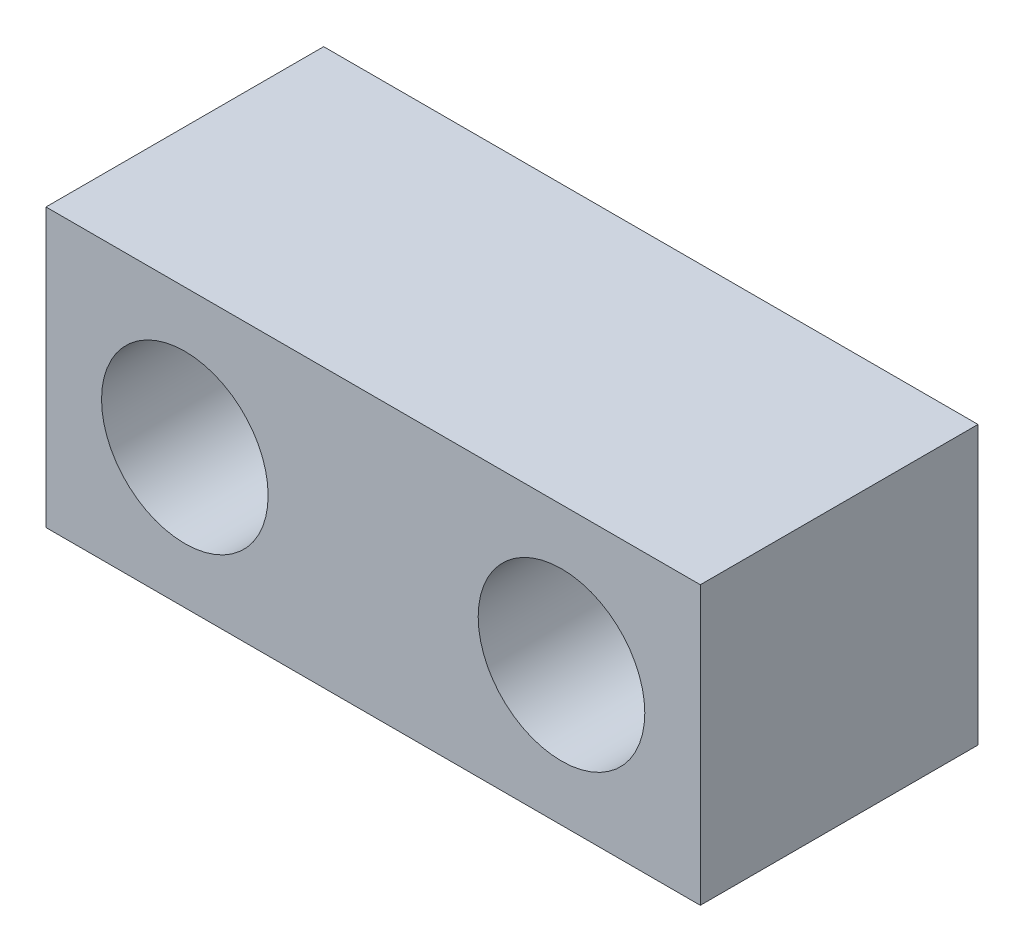
ISO-10303-21;
HEADER;
FILE_DESCRIPTION(('STEP AP214'),'2;1');
FILE_NAME('part.step','',(''),(''),'','','');
FILE_SCHEMA(('AUTOMOTIVE_DESIGN { 1 0 10303 214 1 1 1 1 }'));
ENDSEC;
DATA;
#1=APPLICATION_CONTEXT('core data for automotive mechanical design processes');
#2=APPLICATION_PROTOCOL_DEFINITION('international standard','automotive_design',2000,#1);
#3=PRODUCT_CONTEXT('',#1,'mechanical');
#4=PRODUCT('Part','Part','',(#3));
#5=PRODUCT_RELATED_PRODUCT_CATEGORY('part','',(#4));
#6=PRODUCT_DEFINITION_FORMATION('','',#4);
#7=PRODUCT_DEFINITION_CONTEXT('part definition',#1,'design');
#8=PRODUCT_DEFINITION('design','',#6,#7);
#9=PRODUCT_DEFINITION_SHAPE('','',#8);
#10=(LENGTH_UNIT() NAMED_UNIT(*) SI_UNIT(.MILLI.,.METRE.));
#11=(NAMED_UNIT(*) PLANE_ANGLE_UNIT() SI_UNIT($,.RADIAN.));
#12=(NAMED_UNIT(*) SI_UNIT($,.STERADIAN.) SOLID_ANGLE_UNIT());
#13=UNCERTAINTY_MEASURE_WITH_UNIT(LENGTH_MEASURE(1.E-05),#10,'distance_accuracy_value','');
#14=(GEOMETRIC_REPRESENTATION_CONTEXT(3) GLOBAL_UNCERTAINTY_ASSIGNED_CONTEXT((#13)) GLOBAL_UNIT_ASSIGNED_CONTEXT((#10,
#11,#12)) REPRESENTATION_CONTEXT('',''));
#15=CARTESIAN_POINT('',(0.,0.,0.));
#16=DIRECTION('',(0.,0.,1.));
#17=DIRECTION('',(1.,0.,0.));
#18=AXIS2_PLACEMENT_3D('',#15,#16,#17);
#19=CARTESIAN_POINT('',(0.,0.,20.));
#20=DIRECTION('',(1.,0.,0.));
#21=DIRECTION('',(0.,0.,-1.));
#22=AXIS2_PLACEMENT_3D('',#19,#20,#21);
#23=PLANE('',#22);
#24=DIRECTION('',(0.,-1.,0.));
#25=VECTOR('',#24,1.);
#26=CARTESIAN_POINT('',(0.,0.,0.));
#27=LINE('',#26,#25);
#28=CARTESIAN_POINT('',(0.,20.,0.));
#29=VERTEX_POINT('',#28);
#30=CARTESIAN_POINT('',(0.,0.,0.));
#31=VERTEX_POINT('',#30);
#32=EDGE_CURVE('E94',#29,#31,#27,.T.);
#33=ORIENTED_EDGE('',*,*,#32,.T.);
#34=DIRECTION('',(0.,0.,-1.));
#35=VECTOR('',#34,1.);
#36=CARTESIAN_POINT('',(0.,0.,20.));
#37=LINE('',#36,#35);
#38=CARTESIAN_POINT('',(0.,0.,20.));
#39=VERTEX_POINT('',#38);
#40=EDGE_CURVE('E11',#39,#31,#37,.T.);
#41=ORIENTED_EDGE('',*,*,#40,.F.);
#42=DIRECTION('',(0.,-1.,0.));
#43=VECTOR('',#42,1.);
#44=CARTESIAN_POINT('',(0.,0.,20.));
#45=LINE('',#44,#43);
#46=CARTESIAN_POINT('',(0.,20.,20.));
#47=VERTEX_POINT('',#46);
#48=EDGE_CURVE('E82',#47,#39,#45,.T.);
#49=ORIENTED_EDGE('',*,*,#48,.F.);
#50=DIRECTION('',(0.,0.,-1.));
#51=VECTOR('',#50,1.);
#52=CARTESIAN_POINT('',(0.,20.,20.));
#53=LINE('',#52,#51);
#54=EDGE_CURVE('E90',#47,#29,#53,.T.);
#55=ORIENTED_EDGE('',*,*,#54,.T.);
#56=EDGE_LOOP('',(#33,#41,#49,#55));
#57=FACE_BOUND('',#56,.T.);
#58=ADVANCED_FACE('F31',(#57),#23,.F.);
#59=CARTESIAN_POINT('',(0.,0.,20.));
#60=DIRECTION('',(0.,1.,0.));
#61=DIRECTION('',(0.,0.,1.));
#62=AXIS2_PLACEMENT_3D('',#59,#60,#61);
#63=PLANE('',#62);
#64=DIRECTION('',(1.,0.,0.));
#65=VECTOR('',#64,1.);
#66=CARTESIAN_POINT('',(0.,0.,0.));
#67=LINE('',#66,#65);
#68=CARTESIAN_POINT('',(47.1297055354398,0.,0.));
#69=VERTEX_POINT('',#68);
#70=EDGE_CURVE('E86',#31,#69,#67,.T.);
#71=ORIENTED_EDGE('',*,*,#70,.T.);
#72=DIRECTION('',(0.,0.,-1.));
#73=VECTOR('',#72,1.);
#74=CARTESIAN_POINT('',(47.1297055354398,0.,20.));
#75=LINE('',#74,#73);
#76=CARTESIAN_POINT('',(47.1297055354398,0.,20.));
#77=VERTEX_POINT('',#76);
#78=EDGE_CURVE('E39',#77,#69,#75,.T.);
#79=ORIENTED_EDGE('',*,*,#78,.F.);
#80=DIRECTION('',(1.,0.,0.));
#81=VECTOR('',#80,1.);
#82=CARTESIAN_POINT('',(0.,0.,20.));
#83=LINE('',#82,#81);
#84=EDGE_CURVE('E77',#39,#77,#83,.T.);
#85=ORIENTED_EDGE('',*,*,#84,.F.);
#86=ORIENTED_EDGE('',*,*,#40,.T.);
#87=EDGE_LOOP('',(#71,#79,#85,#86));
#88=FACE_BOUND('',#87,.T.);
#89=ADVANCED_FACE('F85',(#88),#63,.F.);
#90=CARTESIAN_POINT('',(47.1297055354398,0.,20.));
#91=DIRECTION('',(-1.,0.,0.));
#92=DIRECTION('',(0.,0.,1.));
#93=AXIS2_PLACEMENT_3D('',#90,#91,#92);
#94=PLANE('',#93);
#95=DIRECTION('',(0.,1.,0.));
#96=VECTOR('',#95,1.);
#97=CARTESIAN_POINT('',(47.1297055354398,0.,0.));
#98=LINE('',#97,#96);
#99=CARTESIAN_POINT('',(47.1297055354398,20.,0.));
#100=VERTEX_POINT('',#99);
#101=EDGE_CURVE('E64',#69,#100,#98,.T.);
#102=ORIENTED_EDGE('',*,*,#101,.T.);
#103=DIRECTION('',(0.,0.,-1.));
#104=VECTOR('',#103,1.);
#105=CARTESIAN_POINT('',(47.1297055354398,20.,20.));
#106=LINE('',#105,#104);
#107=CARTESIAN_POINT('',(47.1297055354398,20.,20.));
#108=VERTEX_POINT('',#107);
#109=EDGE_CURVE('E87',#108,#100,#106,.T.);
#110=ORIENTED_EDGE('',*,*,#109,.F.);
#111=DIRECTION('',(0.,1.,0.));
#112=VECTOR('',#111,1.);
#113=CARTESIAN_POINT('',(47.1297055354398,0.,20.));
#114=LINE('',#113,#112);
#115=EDGE_CURVE('E80',#77,#108,#114,.T.);
#116=ORIENTED_EDGE('',*,*,#115,.F.);
#117=ORIENTED_EDGE('',*,*,#78,.T.);
#118=EDGE_LOOP('',(#102,#110,#116,#117));
#119=FACE_BOUND('',#118,.T.);
#120=ADVANCED_FACE('F88',(#119),#94,.F.);
#121=CARTESIAN_POINT('',(0.,20.,20.));
#122=DIRECTION('',(0.,-1.,0.));
#123=DIRECTION('',(0.,0.,-1.));
#124=AXIS2_PLACEMENT_3D('',#121,#122,#123);
#125=PLANE('',#124);
#126=DIRECTION('',(-1.,0.,0.));
#127=VECTOR('',#126,1.);
#128=CARTESIAN_POINT('',(0.,20.,0.));
#129=LINE('',#128,#127);
#130=EDGE_CURVE('E70',#100,#29,#129,.T.);
#131=ORIENTED_EDGE('',*,*,#130,.T.);
#132=ORIENTED_EDGE('',*,*,#54,.F.);
#133=DIRECTION('',(-1.,0.,0.));
#134=VECTOR('',#133,1.);
#135=CARTESIAN_POINT('',(0.,20.,20.));
#136=LINE('',#135,#134);
#137=EDGE_CURVE('E47',#108,#47,#136,.T.);
#138=ORIENTED_EDGE('',*,*,#137,.F.);
#139=ORIENTED_EDGE('',*,*,#109,.T.);
#140=EDGE_LOOP('',(#131,#132,#138,#139));
#141=FACE_BOUND('',#140,.T.);
#142=ADVANCED_FACE('F102',(#141),#125,.F.);
#143=CARTESIAN_POINT('',(0.,20.,20.));
#144=DIRECTION('',(0.,0.,-1.));
#145=DIRECTION('',(-1.,0.,0.));
#146=AXIS2_PLACEMENT_3D('',#143,#144,#145);
#147=PLANE('',#146);
#148=CARTESIAN_POINT('',(37.1297055354398,10.,20.));
#149=DIRECTION('',(0.,0.,1.));
#150=DIRECTION('',(1.,0.,0.));
#151=AXIS2_PLACEMENT_3D('',#148,#149,#150);
#152=CIRCLE('',#151,6.);
#153=CARTESIAN_POINT('',(43.1297055354398,10.,20.));
#154=VERTEX_POINT('',#153);
#155=EDGE_CURVE('E116',#154,#154,#152,.T.);
#156=ORIENTED_EDGE('',*,*,#155,.F.);
#157=EDGE_LOOP('',(#156));
#158=FACE_BOUND('',#157,.T.);
#159=CARTESIAN_POINT('',(10.,10.,20.));
#160=DIRECTION('',(0.,0.,1.));
#161=DIRECTION('',(1.,0.,0.));
#162=AXIS2_PLACEMENT_3D('',#159,#160,#161);
#163=CIRCLE('',#162,6.);
#164=CARTESIAN_POINT('',(16.,10.,20.));
#165=VERTEX_POINT('',#164);
#166=EDGE_CURVE('E110',#165,#165,#163,.T.);
#167=ORIENTED_EDGE('',*,*,#166,.F.);
#168=EDGE_LOOP('',(#167));
#169=FACE_BOUND('',#168,.T.);
#170=ORIENTED_EDGE('',*,*,#48,.T.);
#171=ORIENTED_EDGE('',*,*,#84,.T.);
#172=ORIENTED_EDGE('',*,*,#115,.T.);
#173=ORIENTED_EDGE('',*,*,#137,.T.);
#174=EDGE_LOOP('',(#170,#171,#172,#173));
#175=FACE_BOUND('',#174,.T.);
#176=ADVANCED_FACE('F78',(#158,#169,#175),#147,.F.);
#177=CARTESIAN_POINT('',(0.,20.,0.));
#178=DIRECTION('',(0.,0.,-1.));
#179=DIRECTION('',(-1.,0.,0.));
#180=AXIS2_PLACEMENT_3D('',#177,#178,#179);
#181=PLANE('',#180);
#182=CARTESIAN_POINT('',(37.1297055354398,10.,0.));
#183=DIRECTION('',(0.,0.,1.));
#184=DIRECTION('',(1.,0.,0.));
#185=AXIS2_PLACEMENT_3D('',#182,#183,#184);
#186=CIRCLE('',#185,6.);
#187=CARTESIAN_POINT('',(43.1297055354398,10.,0.));
#188=VERTEX_POINT('',#187);
#189=EDGE_CURVE('E113',#188,#188,#186,.T.);
#190=ORIENTED_EDGE('',*,*,#189,.T.);
#191=EDGE_LOOP('',(#190));
#192=FACE_BOUND('',#191,.T.);
#193=CARTESIAN_POINT('',(10.,10.,0.));
#194=DIRECTION('',(0.,0.,1.));
#195=DIRECTION('',(1.,0.,0.));
#196=AXIS2_PLACEMENT_3D('',#193,#194,#195);
#197=CIRCLE('',#196,5.99999999999999);
#198=CARTESIAN_POINT('',(16.,10.,0.));
#199=VERTEX_POINT('',#198);
#200=EDGE_CURVE('E97',#199,#199,#197,.T.);
#201=ORIENTED_EDGE('',*,*,#200,.T.);
#202=EDGE_LOOP('',(#201));
#203=FACE_BOUND('',#202,.T.);
#204=ORIENTED_EDGE('',*,*,#32,.F.);
#205=ORIENTED_EDGE('',*,*,#130,.F.);
#206=ORIENTED_EDGE('',*,*,#101,.F.);
#207=ORIENTED_EDGE('',*,*,#70,.F.);
#208=EDGE_LOOP('',(#204,#205,#206,#207));
#209=FACE_BOUND('',#208,.T.);
#210=ADVANCED_FACE('F105',(#192,#203,#209),#181,.T.);
#211=CARTESIAN_POINT('',(10.,10.,20.));
#212=DIRECTION('',(0.,0.,1.));
#213=DIRECTION('',(1.,0.,0.));
#214=AXIS2_PLACEMENT_3D('',#211,#212,#213);
#215=CYLINDRICAL_SURFACE('',#214,5.99999999999999);
#216=ORIENTED_EDGE('',*,*,#200,.F.);
#217=EDGE_LOOP('',(#216));
#218=FACE_BOUND('',#217,.T.);
#219=ORIENTED_EDGE('',*,*,#166,.T.);
#220=EDGE_LOOP('',(#219));
#221=FACE_BOUND('',#220,.T.);
#222=ADVANCED_FACE('F127',(#218,#221),#215,.F.);
#223=CARTESIAN_POINT('',(37.1297055354398,10.,20.));
#224=DIRECTION('',(0.,0.,1.));
#225=DIRECTION('',(1.,0.,0.));
#226=AXIS2_PLACEMENT_3D('',#223,#224,#225);
#227=CYLINDRICAL_SURFACE('',#226,6.);
#228=ORIENTED_EDGE('',*,*,#189,.F.);
#229=EDGE_LOOP('',(#228));
#230=FACE_BOUND('',#229,.T.);
#231=ORIENTED_EDGE('',*,*,#155,.T.);
#232=EDGE_LOOP('',(#231));
#233=FACE_BOUND('',#232,.T.);
#234=ADVANCED_FACE('F120',(#230,#233),#227,.F.);
#235=CLOSED_SHELL('',(#58,#89,#120,#142,#176,#210,#222,#234));
#236=MANIFOLD_SOLID_BREP('B2',#235);
#237=ADVANCED_BREP_SHAPE_REPRESENTATION('',(#18,#236),#14);
#238=SHAPE_DEFINITION_REPRESENTATION(#9,#237);
ENDSEC;
END-ISO-10303-21;
